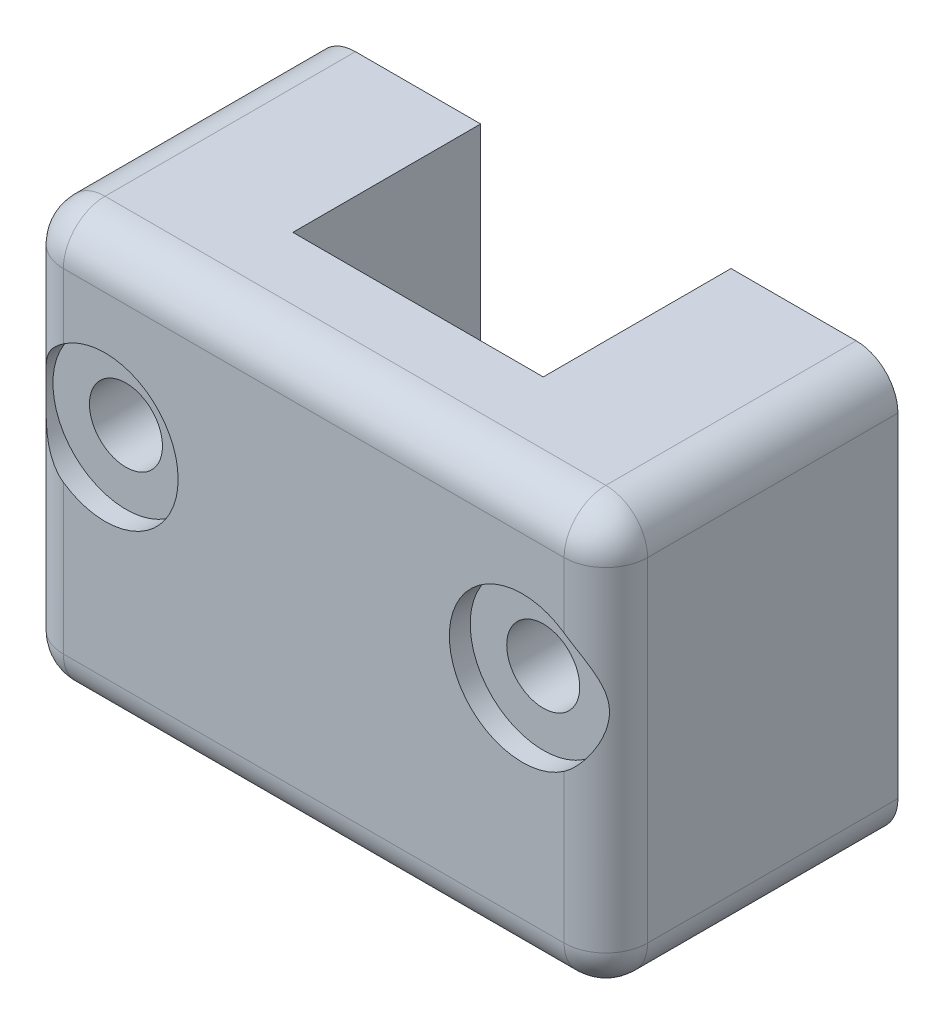
ISO-10303-21;
HEADER;
FILE_DESCRIPTION(('STEP AP214'),'2;1');
FILE_NAME('part.step','',(''),(''),'','','');
FILE_SCHEMA(('AUTOMOTIVE_DESIGN { 1 0 10303 214 1 1 1 1 }'));
ENDSEC;
DATA;
#1=APPLICATION_CONTEXT('core data for automotive mechanical design processes');
#2=APPLICATION_PROTOCOL_DEFINITION('international standard','automotive_design',2000,#1);
#3=PRODUCT_CONTEXT('',#1,'mechanical');
#4=PRODUCT('Part','Part','',(#3));
#5=PRODUCT_RELATED_PRODUCT_CATEGORY('part','',(#4));
#6=PRODUCT_DEFINITION_FORMATION('','',#4);
#7=PRODUCT_DEFINITION_CONTEXT('part definition',#1,'design');
#8=PRODUCT_DEFINITION('design','',#6,#7);
#9=PRODUCT_DEFINITION_SHAPE('','',#8);
#10=(LENGTH_UNIT() NAMED_UNIT(*) SI_UNIT(.MILLI.,.METRE.));
#11=(NAMED_UNIT(*) PLANE_ANGLE_UNIT() SI_UNIT($,.RADIAN.));
#12=(NAMED_UNIT(*) SI_UNIT($,.STERADIAN.) SOLID_ANGLE_UNIT());
#13=UNCERTAINTY_MEASURE_WITH_UNIT(LENGTH_MEASURE(1.E-05),#10,'distance_accuracy_value','');
#14=(GEOMETRIC_REPRESENTATION_CONTEXT(3) GLOBAL_UNCERTAINTY_ASSIGNED_CONTEXT((#13)) GLOBAL_UNIT_ASSIGNED_CONTEXT((#10,
#11,#12)) REPRESENTATION_CONTEXT('',''));
#15=CARTESIAN_POINT('',(0.,0.,0.));
#16=DIRECTION('',(0.,0.,1.));
#17=DIRECTION('',(1.,0.,0.));
#18=AXIS2_PLACEMENT_3D('',#15,#16,#17);
#19=CARTESIAN_POINT('',(10.,5.75,19.9497474683058));
#20=DIRECTION('',(0.,0.,-1.));
#21=DIRECTION('',(-1.,0.,0.));
#22=AXIS2_PLACEMENT_3D('',#19,#20,#21);
#23=CYLINDRICAL_SURFACE('',#22,1.75);
#24=CARTESIAN_POINT('',(10.,5.75,1.));
#25=DIRECTION('',(0.,0.,-1.));
#26=DIRECTION('',(-1.,0.,0.));
#27=AXIS2_PLACEMENT_3D('',#24,#25,#26);
#28=CIRCLE('',#27,1.75);
#29=CARTESIAN_POINT('',(8.25,5.75,1.));
#30=VERTEX_POINT('',#29);
#31=EDGE_CURVE('E172',#30,#30,#28,.T.);
#32=ORIENTED_EDGE('',*,*,#31,.T.);
#33=EDGE_LOOP('',(#32));
#34=FACE_BOUND('',#33,.T.);
#35=CARTESIAN_POINT('',(10.,5.75,14.));
#36=DIRECTION('',(0.,0.,1.));
#37=DIRECTION('',(1.,0.,0.));
#38=AXIS2_PLACEMENT_3D('',#35,#36,#37);
#39=CIRCLE('',#38,1.75);
#40=CARTESIAN_POINT('',(11.75,5.75,14.));
#41=VERTEX_POINT('',#40);
#42=EDGE_CURVE('E191',#41,#41,#39,.F.);
#43=ORIENTED_EDGE('',*,*,#42,.F.);
#44=EDGE_LOOP('',(#43));
#45=FACE_BOUND('',#44,.T.);
#46=ADVANCED_FACE('F37',(#34,#45),#23,.F.);
#47=CARTESIAN_POINT('',(-10.,5.75,19.9497474683058));
#48=DIRECTION('',(0.,0.,-1.));
#49=DIRECTION('',(-1.,0.,0.));
#50=AXIS2_PLACEMENT_3D('',#47,#48,#49);
#51=CYLINDRICAL_SURFACE('',#50,1.75);
#52=CARTESIAN_POINT('',(-10.,5.75,1.));
#53=DIRECTION('',(0.,0.,-1.));
#54=DIRECTION('',(-1.,0.,0.));
#55=AXIS2_PLACEMENT_3D('',#52,#53,#54);
#56=CIRCLE('',#55,1.75);
#57=CARTESIAN_POINT('',(-11.75,5.75,1.));
#58=VERTEX_POINT('',#57);
#59=EDGE_CURVE('E195',#58,#58,#56,.T.);
#60=ORIENTED_EDGE('',*,*,#59,.T.);
#61=EDGE_LOOP('',(#60));
#62=FACE_BOUND('',#61,.T.);
#63=CARTESIAN_POINT('',(-10.,5.75,14.));
#64=DIRECTION('',(0.,0.,1.));
#65=DIRECTION('',(1.,0.,0.));
#66=AXIS2_PLACEMENT_3D('',#63,#64,#65);
#67=CIRCLE('',#66,1.75);
#68=CARTESIAN_POINT('',(-8.25,5.75,14.));
#69=VERTEX_POINT('',#68);
#70=EDGE_CURVE('E188',#69,#69,#67,.F.);
#71=ORIENTED_EDGE('',*,*,#70,.F.);
#72=EDGE_LOOP('',(#71));
#73=FACE_BOUND('',#72,.T.);
#74=ADVANCED_FACE('F270',(#62,#73),#51,.F.);
#75=CARTESIAN_POINT('',(0.,-6.25,0.));
#76=DIRECTION('',(0.,-1.,0.));
#77=DIRECTION('',(0.,0.,-1.));
#78=AXIS2_PLACEMENT_3D('',#75,#76,#77);
#79=PLANE('',#78);
#80=DIRECTION('',(-1.,0.,0.));
#81=VECTOR('',#80,1.);
#82=CARTESIAN_POINT('',(6.,-6.25,1.));
#83=LINE('',#82,#81);
#84=CARTESIAN_POINT('',(12.,-6.25,1.));
#85=VERTEX_POINT('',#84);
#86=CARTESIAN_POINT('',(6.,-6.25,1.));
#87=VERTEX_POINT('',#86);
#88=EDGE_CURVE('E349',#85,#87,#83,.T.);
#89=ORIENTED_EDGE('',*,*,#88,.F.);
#90=DIRECTION('',(0.,0.,1.));
#91=VECTOR('',#90,1.);
#92=CARTESIAN_POINT('',(12.,-6.25,0.));
#93=LINE('',#92,#91);
#94=CARTESIAN_POINT('',(12.,-6.25,13.));
#95=VERTEX_POINT('',#94);
#96=EDGE_CURVE('E219',#85,#95,#93,.T.);
#97=ORIENTED_EDGE('',*,*,#96,.T.);
#98=DIRECTION('',(1.,0.,0.));
#99=VECTOR('',#98,1.);
#100=CARTESIAN_POINT('',(0.,-6.25,13.));
#101=LINE('',#100,#99);
#102=CARTESIAN_POINT('',(-12.,-6.25,13.));
#103=VERTEX_POINT('',#102);
#104=EDGE_CURVE('E217',#95,#103,#101,.F.);
#105=ORIENTED_EDGE('',*,*,#104,.T.);
#106=DIRECTION('',(0.,0.,1.));
#107=VECTOR('',#106,1.);
#108=CARTESIAN_POINT('',(-12.,-6.25,0.));
#109=LINE('',#108,#107);
#110=CARTESIAN_POINT('',(-12.,-6.25,1.));
#111=VERTEX_POINT('',#110);
#112=EDGE_CURVE('E215',#103,#111,#109,.F.);
#113=ORIENTED_EDGE('',*,*,#112,.T.);
#114=DIRECTION('',(-1.,0.,0.));
#115=VECTOR('',#114,1.);
#116=CARTESIAN_POINT('',(-6.,-6.25,1.));
#117=LINE('',#116,#115);
#118=CARTESIAN_POINT('',(-6.,-6.25,1.));
#119=VERTEX_POINT('',#118);
#120=EDGE_CURVE('E184',#119,#111,#117,.T.);
#121=ORIENTED_EDGE('',*,*,#120,.F.);
#122=DIRECTION('',(0.,0.,1.));
#123=VECTOR('',#122,1.);
#124=CARTESIAN_POINT('',(-6.,-6.25,0.));
#125=LINE('',#124,#123);
#126=CARTESIAN_POINT('',(-6.,-6.25,10.));
#127=VERTEX_POINT('',#126);
#128=EDGE_CURVE('E159',#119,#127,#125,.T.);
#129=ORIENTED_EDGE('',*,*,#128,.T.);
#130=DIRECTION('',(-1.,0.,0.));
#131=VECTOR('',#130,1.);
#132=CARTESIAN_POINT('',(6.,-6.25,10.));
#133=LINE('',#132,#131);
#134=CARTESIAN_POINT('',(6.,-6.25,10.));
#135=VERTEX_POINT('',#134);
#136=EDGE_CURVE('E151',#135,#127,#133,.T.);
#137=ORIENTED_EDGE('',*,*,#136,.F.);
#138=DIRECTION('',(0.,0.,-1.));
#139=VECTOR('',#138,1.);
#140=CARTESIAN_POINT('',(6.,-6.25,10.));
#141=LINE('',#140,#139);
#142=EDGE_CURVE('E156',#135,#87,#141,.T.);
#143=ORIENTED_EDGE('',*,*,#142,.T.);
#144=EDGE_LOOP('',(#89,#97,#105,#113,#121,#129,#137,#143));
#145=FACE_BOUND('',#144,.T.);
#146=ADVANCED_FACE('F154',(#145),#79,.T.);
#147=CARTESIAN_POINT('',(0.,13.75,0.));
#148=DIRECTION('',(0.,-1.,0.));
#149=DIRECTION('',(0.,0.,-1.));
#150=AXIS2_PLACEMENT_3D('',#147,#148,#149);
#151=PLANE('',#150);
#152=DIRECTION('',(-1.,0.,0.));
#153=VECTOR('',#152,1.);
#154=CARTESIAN_POINT('',(14.,13.75,13.));
#155=LINE('',#154,#153);
#156=CARTESIAN_POINT('',(-12.,13.75,13.));
#157=VERTEX_POINT('',#156);
#158=CARTESIAN_POINT('',(12.,13.75,13.));
#159=VERTEX_POINT('',#158);
#160=EDGE_CURVE('E210',#157,#159,#155,.F.);
#161=ORIENTED_EDGE('',*,*,#160,.T.);
#162=DIRECTION('',(0.,0.,1.));
#163=VECTOR('',#162,1.);
#164=CARTESIAN_POINT('',(12.,13.75,0.999999999999997));
#165=LINE('',#164,#163);
#166=CARTESIAN_POINT('',(12.,13.75,1.));
#167=VERTEX_POINT('',#166);
#168=EDGE_CURVE('E213',#159,#167,#165,.F.);
#169=ORIENTED_EDGE('',*,*,#168,.T.);
#170=DIRECTION('',(1.,0.,0.));
#171=VECTOR('',#170,1.);
#172=CARTESIAN_POINT('',(-14.,13.75,1.));
#173=LINE('',#172,#171);
#174=CARTESIAN_POINT('',(6.,13.75,1.));
#175=VERTEX_POINT('',#174);
#176=EDGE_CURVE('E340',#175,#167,#173,.T.);
#177=ORIENTED_EDGE('',*,*,#176,.F.);
#178=DIRECTION('',(0.,0.,-1.));
#179=VECTOR('',#178,1.);
#180=CARTESIAN_POINT('',(6.,13.75,10.));
#181=LINE('',#180,#179);
#182=CARTESIAN_POINT('',(6.,13.75,10.));
#183=VERTEX_POINT('',#182);
#184=EDGE_CURVE('E181',#183,#175,#181,.T.);
#185=ORIENTED_EDGE('',*,*,#184,.F.);
#186=DIRECTION('',(1.,0.,0.));
#187=VECTOR('',#186,1.);
#188=CARTESIAN_POINT('',(6.,13.75,10.));
#189=LINE('',#188,#187);
#190=CARTESIAN_POINT('',(-6.,13.75,10.));
#191=VERTEX_POINT('',#190);
#192=EDGE_CURVE('E168',#191,#183,#189,.T.);
#193=ORIENTED_EDGE('',*,*,#192,.F.);
#194=DIRECTION('',(0.,0.,1.));
#195=VECTOR('',#194,1.);
#196=CARTESIAN_POINT('',(-6.,13.75,0.));
#197=LINE('',#196,#195);
#198=CARTESIAN_POINT('',(-6.,13.75,1.));
#199=VERTEX_POINT('',#198);
#200=EDGE_CURVE('E176',#199,#191,#197,.T.);
#201=ORIENTED_EDGE('',*,*,#200,.F.);
#202=CARTESIAN_POINT('',(-12.,13.75,1.));
#203=VERTEX_POINT('',#202);
#204=EDGE_CURVE('E335',#203,#199,#173,.T.);
#205=ORIENTED_EDGE('',*,*,#204,.F.);
#206=DIRECTION('',(0.,0.,1.));
#207=VECTOR('',#206,1.);
#208=CARTESIAN_POINT('',(-12.,13.75,15.));
#209=LINE('',#208,#207);
#210=EDGE_CURVE('E208',#203,#157,#209,.T.);
#211=ORIENTED_EDGE('',*,*,#210,.T.);
#212=EDGE_LOOP('',(#161,#169,#177,#185,#193,#201,#205,#211));
#213=FACE_BOUND('',#212,.T.);
#214=ADVANCED_FACE('F302',(#213),#151,.F.);
#215=CARTESIAN_POINT('',(6.,-6.25,10.));
#216=DIRECTION('',(1.,0.,0.));
#217=DIRECTION('',(0.,0.,-1.));
#218=AXIS2_PLACEMENT_3D('',#215,#216,#217);
#219=PLANE('',#218);
#220=ORIENTED_EDGE('',*,*,#184,.T.);
#221=DIRECTION('',(0.,1.,0.));
#222=VECTOR('',#221,1.);
#223=CARTESIAN_POINT('',(6.,6.25,1.));
#224=LINE('',#223,#222);
#225=EDGE_CURVE('E175',#87,#175,#224,.T.);
#226=ORIENTED_EDGE('',*,*,#225,.F.);
#227=ORIENTED_EDGE('',*,*,#142,.F.);
#228=DIRECTION('',(0.,-1.,0.));
#229=VECTOR('',#228,1.);
#230=CARTESIAN_POINT('',(6.,13.75,10.));
#231=LINE('',#230,#229);
#232=EDGE_CURVE('E163',#183,#135,#231,.T.);
#233=ORIENTED_EDGE('',*,*,#232,.F.);
#234=EDGE_LOOP('',(#220,#226,#227,#233));
#235=FACE_BOUND('',#234,.T.);
#236=ADVANCED_FACE('F174',(#235),#219,.F.);
#237=CARTESIAN_POINT('',(-6.,-6.25,0.));
#238=DIRECTION('',(-1.,0.,0.));
#239=DIRECTION('',(0.,0.,1.));
#240=AXIS2_PLACEMENT_3D('',#237,#238,#239);
#241=PLANE('',#240);
#242=DIRECTION('',(0.,-1.,0.));
#243=VECTOR('',#242,1.);
#244=CARTESIAN_POINT('',(-6.,6.25,1.));
#245=LINE('',#244,#243);
#246=EDGE_CURVE('E351',#199,#119,#245,.T.);
#247=ORIENTED_EDGE('',*,*,#246,.F.);
#248=ORIENTED_EDGE('',*,*,#200,.T.);
#249=DIRECTION('',(0.,1.,0.));
#250=VECTOR('',#249,1.);
#251=CARTESIAN_POINT('',(-6.,13.75,10.));
#252=LINE('',#251,#250);
#253=EDGE_CURVE('E162',#127,#191,#252,.T.);
#254=ORIENTED_EDGE('',*,*,#253,.F.);
#255=ORIENTED_EDGE('',*,*,#128,.F.);
#256=EDGE_LOOP('',(#247,#248,#254,#255));
#257=FACE_BOUND('',#256,.T.);
#258=ADVANCED_FACE('F295',(#257),#241,.F.);
#259=CARTESIAN_POINT('',(0.,0.,15.));
#260=DIRECTION('',(0.,0.,1.));
#261=DIRECTION('',(1.,0.,0.));
#262=AXIS2_PLACEMENT_3D('',#259,#260,#261);
#263=PLANE('',#262);
#264=CARTESIAN_POINT('',(-10.,5.75,15.));
#265=DIRECTION('',(0.,0.,1.));
#266=DIRECTION('',(1.,0.,0.));
#267=AXIS2_PLACEMENT_3D('',#264,#265,#266);
#268=CIRCLE('',#267,3.5);
#269=CARTESIAN_POINT('',(-12.,2.87771867673099,15.));
#270=VERTEX_POINT('',#269);
#271=CARTESIAN_POINT('',(-12.,8.62228132326902,15.));
#272=VERTEX_POINT('',#271);
#273=EDGE_CURVE('E402',#270,#272,#268,.T.);
#274=ORIENTED_EDGE('',*,*,#273,.F.);
#275=DIRECTION('',(0.,-1.,0.));
#276=VECTOR('',#275,1.);
#277=CARTESIAN_POINT('',(-12.,0.,15.));
#278=LINE('',#277,#276);
#279=CARTESIAN_POINT('',(-12.,-4.25,15.));
#280=VERTEX_POINT('',#279);
#281=EDGE_CURVE('E206',#270,#280,#278,.T.);
#282=ORIENTED_EDGE('',*,*,#281,.T.);
#283=DIRECTION('',(1.,0.,0.));
#284=VECTOR('',#283,1.);
#285=CARTESIAN_POINT('',(0.,-4.25,15.));
#286=LINE('',#285,#284);
#287=CARTESIAN_POINT('',(12.,-4.25,15.));
#288=VERTEX_POINT('',#287);
#289=EDGE_CURVE('E204',#280,#288,#286,.T.);
#290=ORIENTED_EDGE('',*,*,#289,.T.);
#291=DIRECTION('',(0.,1.,0.));
#292=VECTOR('',#291,1.);
#293=CARTESIAN_POINT('',(12.,0.,15.));
#294=LINE('',#293,#292);
#295=CARTESIAN_POINT('',(12.,2.87771867673099,15.));
#296=VERTEX_POINT('',#295);
#297=EDGE_CURVE('E202',#288,#296,#294,.T.);
#298=ORIENTED_EDGE('',*,*,#297,.T.);
#299=CARTESIAN_POINT('',(10.,5.75,15.));
#300=DIRECTION('',(0.,0.,1.));
#301=DIRECTION('',(1.,0.,0.));
#302=AXIS2_PLACEMENT_3D('',#299,#300,#301);
#303=CIRCLE('',#302,3.5);
#304=CARTESIAN_POINT('',(12.,8.62228132326901,15.));
#305=VERTEX_POINT('',#304);
#306=EDGE_CURVE('E406',#305,#296,#303,.T.);
#307=ORIENTED_EDGE('',*,*,#306,.F.);
#308=DIRECTION('',(0.,1.,0.));
#309=VECTOR('',#308,1.);
#310=CARTESIAN_POINT('',(12.,0.,15.));
#311=LINE('',#310,#309);
#312=CARTESIAN_POINT('',(12.,11.75,15.));
#313=VERTEX_POINT('',#312);
#314=EDGE_CURVE('E178',#305,#313,#311,.T.);
#315=ORIENTED_EDGE('',*,*,#314,.T.);
#316=DIRECTION('',(-1.,0.,0.));
#317=VECTOR('',#316,1.);
#318=CARTESIAN_POINT('',(-14.,11.75,15.));
#319=LINE('',#318,#317);
#320=CARTESIAN_POINT('',(-12.,11.75,15.));
#321=VERTEX_POINT('',#320);
#322=EDGE_CURVE('E197',#313,#321,#319,.T.);
#323=ORIENTED_EDGE('',*,*,#322,.T.);
#324=DIRECTION('',(0.,-1.,0.));
#325=VECTOR('',#324,1.);
#326=CARTESIAN_POINT('',(-12.,0.,15.));
#327=LINE('',#326,#325);
#328=EDGE_CURVE('E200',#321,#272,#327,.T.);
#329=ORIENTED_EDGE('',*,*,#328,.T.);
#330=EDGE_LOOP('',(#274,#282,#290,#298,#307,#315,#323,#329));
#331=FACE_BOUND('',#330,.T.);
#332=ADVANCED_FACE('F291',(#331),#263,.T.);
#333=CARTESIAN_POINT('',(0.,0.,1.));
#334=DIRECTION('',(0.,0.,-1.));
#335=DIRECTION('',(-1.,0.,0.));
#336=AXIS2_PLACEMENT_3D('',#333,#334,#335);
#337=PLANE('',#336);
#338=ORIENTED_EDGE('',*,*,#59,.F.);
#339=EDGE_LOOP('',(#338));
#340=FACE_BOUND('',#339,.T.);
#341=DIRECTION('',(0.,-1.,0.));
#342=VECTOR('',#341,1.);
#343=CARTESIAN_POINT('',(-14.,13.75,1.));
#344=LINE('',#343,#342);
#345=CARTESIAN_POINT('',(-14.,11.75,1.));
#346=VERTEX_POINT('',#345);
#347=CARTESIAN_POINT('',(-14.,-4.25,1.));
#348=VERTEX_POINT('',#347);
#349=EDGE_CURVE('E337',#346,#348,#344,.T.);
#350=ORIENTED_EDGE('',*,*,#349,.F.);
#351=CARTESIAN_POINT('',(-12.,11.75,1.));
#352=DIRECTION('',(0.,0.,-1.));
#353=DIRECTION('',(-1.,0.,0.));
#354=AXIS2_PLACEMENT_3D('',#351,#352,#353);
#355=CIRCLE('',#354,2.);
#356=EDGE_CURVE('E237',#346,#203,#355,.T.);
#357=ORIENTED_EDGE('',*,*,#356,.T.);
#358=ORIENTED_EDGE('',*,*,#204,.T.);
#359=ORIENTED_EDGE('',*,*,#246,.T.);
#360=ORIENTED_EDGE('',*,*,#120,.T.);
#361=CARTESIAN_POINT('',(-12.,-4.25,1.));
#362=DIRECTION('',(0.,0.,-1.));
#363=DIRECTION('',(-1.,0.,0.));
#364=AXIS2_PLACEMENT_3D('',#361,#362,#363);
#365=CIRCLE('',#364,2.);
#366=EDGE_CURVE('E235',#111,#348,#365,.T.);
#367=ORIENTED_EDGE('',*,*,#366,.T.);
#368=EDGE_LOOP('',(#350,#357,#358,#359,#360,#367));
#369=FACE_BOUND('',#368,.T.);
#370=ADVANCED_FACE('F287',(#340,#369),#337,.T.);
#371=CARTESIAN_POINT('',(0.,0.,1.));
#372=DIRECTION('',(0.,0.,1.));
#373=DIRECTION('',(1.,0.,0.));
#374=AXIS2_PLACEMENT_3D('',#371,#372,#373);
#375=PLANE('',#374);
#376=ORIENTED_EDGE('',*,*,#31,.F.);
#377=EDGE_LOOP('',(#376));
#378=FACE_BOUND('',#377,.T.);
#379=DIRECTION('',(0.,1.,0.));
#380=VECTOR('',#379,1.);
#381=CARTESIAN_POINT('',(14.,13.75,1.));
#382=LINE('',#381,#380);
#383=CARTESIAN_POINT('',(14.,-4.25,1.));
#384=VERTEX_POINT('',#383);
#385=CARTESIAN_POINT('',(14.,11.75,1.));
#386=VERTEX_POINT('',#385);
#387=EDGE_CURVE('E339',#384,#386,#382,.T.);
#388=ORIENTED_EDGE('',*,*,#387,.F.);
#389=CARTESIAN_POINT('',(12.,-4.25,1.));
#390=DIRECTION('',(0.,0.,1.));
#391=DIRECTION('',(1.,0.,0.));
#392=AXIS2_PLACEMENT_3D('',#389,#390,#391);
#393=CIRCLE('',#392,2.);
#394=EDGE_CURVE('E229',#384,#85,#393,.F.);
#395=ORIENTED_EDGE('',*,*,#394,.T.);
#396=ORIENTED_EDGE('',*,*,#88,.T.);
#397=ORIENTED_EDGE('',*,*,#225,.T.);
#398=ORIENTED_EDGE('',*,*,#176,.T.);
#399=CARTESIAN_POINT('',(12.,11.75,1.));
#400=DIRECTION('',(0.,0.,1.));
#401=DIRECTION('',(1.,0.,0.));
#402=AXIS2_PLACEMENT_3D('',#399,#400,#401);
#403=CIRCLE('',#402,2.);
#404=EDGE_CURVE('E227',#167,#386,#403,.F.);
#405=ORIENTED_EDGE('',*,*,#404,.T.);
#406=EDGE_LOOP('',(#388,#395,#396,#397,#398,#405));
#407=FACE_BOUND('',#406,.T.);
#408=ADVANCED_FACE('F284',(#378,#407),#375,.F.);
#409=CARTESIAN_POINT('',(-14.,13.75,-19.3960780543711));
#410=DIRECTION('',(-1.,0.,0.));
#411=DIRECTION('',(0.,-1.,0.));
#412=AXIS2_PLACEMENT_3D('',#409,#410,#411);
#413=PLANE('',#412);
#414=DIRECTION('',(0.,-1.,0.));
#415=VECTOR('',#414,1.);
#416=CARTESIAN_POINT('',(-14.,13.75,13.));
#417=LINE('',#416,#415);
#418=CARTESIAN_POINT('',(-14.,-4.25,13.));
#419=VERTEX_POINT('',#418);
#420=CARTESIAN_POINT('',(-14.,11.75,13.));
#421=VERTEX_POINT('',#420);
#422=EDGE_CURVE('E54',#419,#421,#417,.F.);
#423=ORIENTED_EDGE('',*,*,#422,.T.);
#424=DIRECTION('',(0.,0.,1.));
#425=VECTOR('',#424,1.);
#426=CARTESIAN_POINT('',(-14.,11.75,1.));
#427=LINE('',#426,#425);
#428=EDGE_CURVE('E233',#421,#346,#427,.F.);
#429=ORIENTED_EDGE('',*,*,#428,.T.);
#430=ORIENTED_EDGE('',*,*,#349,.T.);
#431=DIRECTION('',(0.,0.,1.));
#432=VECTOR('',#431,1.);
#433=CARTESIAN_POINT('',(-14.,-4.25,-19.3960780543711));
#434=LINE('',#433,#432);
#435=EDGE_CURVE('E59',#348,#419,#434,.T.);
#436=ORIENTED_EDGE('',*,*,#435,.T.);
#437=EDGE_LOOP('',(#423,#429,#430,#436));
#438=FACE_BOUND('',#437,.T.);
#439=ADVANCED_FACE('F280',(#438),#413,.T.);
#440=CARTESIAN_POINT('',(14.,13.75,-19.3960780543711));
#441=DIRECTION('',(1.,0.,0.));
#442=DIRECTION('',(0.,1.,0.));
#443=AXIS2_PLACEMENT_3D('',#440,#441,#442);
#444=PLANE('',#443);
#445=DIRECTION('',(0.,1.,0.));
#446=VECTOR('',#445,1.);
#447=CARTESIAN_POINT('',(14.,13.75,13.));
#448=LINE('',#447,#446);
#449=CARTESIAN_POINT('',(14.,11.75,13.));
#450=VERTEX_POINT('',#449);
#451=CARTESIAN_POINT('',(14.,-4.25,13.));
#452=VERTEX_POINT('',#451);
#453=EDGE_CURVE('E221',#450,#452,#448,.F.);
#454=ORIENTED_EDGE('',*,*,#453,.T.);
#455=DIRECTION('',(0.,0.,1.));
#456=VECTOR('',#455,1.);
#457=CARTESIAN_POINT('',(14.,-4.25,-19.3960780543711));
#458=LINE('',#457,#456);
#459=EDGE_CURVE('E225',#452,#384,#458,.F.);
#460=ORIENTED_EDGE('',*,*,#459,.T.);
#461=ORIENTED_EDGE('',*,*,#387,.T.);
#462=DIRECTION('',(0.,0.,1.));
#463=VECTOR('',#462,1.);
#464=CARTESIAN_POINT('',(14.,11.75,15.));
#465=LINE('',#464,#463);
#466=EDGE_CURVE('E223',#386,#450,#465,.T.);
#467=ORIENTED_EDGE('',*,*,#466,.T.);
#468=EDGE_LOOP('',(#454,#460,#461,#467));
#469=FACE_BOUND('',#468,.T.);
#470=ADVANCED_FACE('F277',(#469),#444,.T.);
#471=CARTESIAN_POINT('',(0.,0.,10.));
#472=DIRECTION('',(0.,0.,-1.));
#473=DIRECTION('',(-1.,0.,0.));
#474=AXIS2_PLACEMENT_3D('',#471,#472,#473);
#475=PLANE('',#474);
#476=ORIENTED_EDGE('',*,*,#232,.T.);
#477=ORIENTED_EDGE('',*,*,#136,.T.);
#478=ORIENTED_EDGE('',*,*,#253,.T.);
#479=ORIENTED_EDGE('',*,*,#192,.T.);
#480=EDGE_LOOP('',(#476,#477,#478,#479));
#481=FACE_BOUND('',#480,.T.);
#482=ADVANCED_FACE('F166',(#481),#475,.T.);
#483=CARTESIAN_POINT('',(-10.,5.75,14.));
#484=DIRECTION('',(0.,0.,1.));
#485=DIRECTION('',(1.,0.,0.));
#486=AXIS2_PLACEMENT_3D('',#483,#484,#485);
#487=PLANE('',#486);
#488=CARTESIAN_POINT('',(-10.,5.75,14.));
#489=DIRECTION('',(0.,0.,1.));
#490=DIRECTION('',(1.,0.,0.));
#491=AXIS2_PLACEMENT_3D('',#488,#489,#490);
#492=CIRCLE('',#491,3.5);
#493=CARTESIAN_POINT('',(-6.5,5.75,14.));
#494=VERTEX_POINT('',#493);
#495=EDGE_CURVE('E399',#494,#494,#492,.T.);
#496=ORIENTED_EDGE('',*,*,#495,.T.);
#497=EDGE_LOOP('',(#496));
#498=FACE_BOUND('',#497,.T.);
#499=ORIENTED_EDGE('',*,*,#70,.T.);
#500=EDGE_LOOP('',(#499));
#501=FACE_BOUND('',#500,.T.);
#502=ADVANCED_FACE('F260',(#498,#501),#487,.T.);
#503=CARTESIAN_POINT('',(-10.,5.75,14.));
#504=DIRECTION('',(0.,0.,1.));
#505=DIRECTION('',(1.,0.,0.));
#506=AXIS2_PLACEMENT_3D('',#503,#504,#505);
#507=CYLINDRICAL_SURFACE('',#506,3.5);
#508=ORIENTED_EDGE('',*,*,#495,.F.);
#509=EDGE_LOOP('',(#508));
#510=FACE_BOUND('',#509,.T.);
#511=ORIENTED_EDGE('',*,*,#273,.T.);
#512=CARTESIAN_POINT('',(-12.,8.62228132326902,15.));
#513=CARTESIAN_POINT('',(-12.0707404529385,8.57305148371689,14.9999975985316));
#514=CARTESIAN_POINT('',(-12.1395514673426,8.52123281180509,14.9962499540065));
#515=CARTESIAN_POINT('',(-12.2726511080301,8.41314559761035,14.9824544929225));
#516=CARTESIAN_POINT('',(-12.3369505060331,8.35688838653779,14.9724222927287));
#517=CARTESIAN_POINT('',(-12.4600811145566,8.24100216189633,14.9473660892893));
#518=CARTESIAN_POINT('',(-12.5189618231834,8.18141384326659,14.9323945625418));
#519=CARTESIAN_POINT('',(-12.6318292156607,8.0587709289923,14.8984904512209));
#520=CARTESIAN_POINT('',(-12.6858123972928,7.99571390383838,14.8795550636013));
#521=CARTESIAN_POINT('',(-12.7996630823864,7.8528337029009,14.8344051308554));
#522=CARTESIAN_POINT('',(-12.8583515028797,7.77229033694317,14.8074984513498));
#523=CARTESIAN_POINT('',(-12.9682954079903,7.60716655519253,14.7510632053208));
#524=CARTESIAN_POINT('',(-13.0195497400888,7.5225855161283,14.7215342334008));
#525=CARTESIAN_POINT('',(-13.1148353209157,7.3492567236845,14.6614231192136));
#526=CARTESIAN_POINT('',(-13.1588329133992,7.26049188215087,14.6308368239197));
#527=CARTESIAN_POINT('',(-13.2392382520641,7.07934708452369,14.5706088948472));
#528=CARTESIAN_POINT('',(-13.27564818348,6.98696817840352,14.5409669911743));
#529=CARTESIAN_POINT('',(-13.3563922850762,6.75319162133889,14.471139463264));
#530=CARTESIAN_POINT('',(-13.3961286387685,6.60956757583049,14.4327307009885));
#531=CARTESIAN_POINT('',(-13.4419206260524,6.38935364679522,14.3861246993893));
#532=CARTESIAN_POINT('',(-13.4548697982814,6.3153121921326,14.3724410590487));
#533=CARTESIAN_POINT('',(-13.4760230038234,6.16587330215798,14.3496661016538));
#534=CARTESIAN_POINT('',(-13.4842299683005,6.09047673422643,14.3405719482733));
#535=CARTESIAN_POINT('',(-13.4957966824141,5.93794424289336,14.3276561588066));
#536=CARTESIAN_POINT('',(-13.4990976794361,5.86079829709572,14.3238984539748));
#537=CARTESIAN_POINT('',(-13.5005798078859,5.706395999454,14.3222185071639));
#538=CARTESIAN_POINT('',(-13.4987611854201,5.62913965309544,14.3242959846807));
#539=CARTESIAN_POINT('',(-13.4900426658933,5.47510694088815,14.334096674335));
#540=CARTESIAN_POINT('',(-13.4831313757682,5.39833204111702,14.3418325448641));
#541=CARTESIAN_POINT('',(-13.4643793886994,5.24604292991952,14.3622717970667));
#542=CARTESIAN_POINT('',(-13.452535396036,5.17052959654322,14.3749784995904));
#543=CARTESIAN_POINT('',(-13.4037715097876,4.91423823269435,14.4254408439194));
#544=CARTESIAN_POINT('',(-13.3552231363788,4.73747812666193,14.4730193445007));
#545=CARTESIAN_POINT('',(-13.2633037874413,4.48147761718882,14.5510321751375));
#546=CARTESIAN_POINT('',(-13.2293788256557,4.39748082894041,14.5782157323008));
#547=CARTESIAN_POINT('',(-13.1552327974387,4.2325480139004,14.6332679461288));
#548=CARTESIAN_POINT('',(-13.1150152148331,4.15161032408162,14.661136216557));
#549=CARTESIAN_POINT('',(-13.0263144925784,3.98921005791501,14.7174304976417));
#550=CARTESIAN_POINT('',(-12.977533718083,3.90789846435229,14.745822073934));
#551=CARTESIAN_POINT('',(-12.8731152969813,3.74893798191831,14.8003164209095));
#552=CARTESIAN_POINT('',(-12.8174758256442,3.67129007538795,14.8264185793265));
#553=CARTESIAN_POINT('',(-12.6997207770924,3.52051517763947,14.874677825244));
#554=CARTESIAN_POINT('',(-12.6376447616087,3.44736451184677,14.8968569818361));
#555=CARTESIAN_POINT('',(-12.5069362532296,3.30571162138766,14.9358880276237));
#556=CARTESIAN_POINT('',(-12.438309792973,3.23720521717019,14.9527447580287));
#557=CARTESIAN_POINT('',(-12.3092971573975,3.11880622701179,14.9767973594979));
#558=CARTESIAN_POINT('',(-12.2500388181988,3.06794533503691,14.9852557477087));
#559=CARTESIAN_POINT('',(-12.1277302320402,2.96989955665786,14.9968656209606));
#560=CARTESIAN_POINT('',(-12.0646673674991,2.92272824512083,14.9999983140612));
#561=CARTESIAN_POINT('',(-12.,2.87771867673099,15.));
#562=B_SPLINE_CURVE_WITH_KNOTS('',3,(#512,#513,#514,#515,#516,#517,#518,#519,#520,#521,#522,
#523,#524,#525,#526,#527,#528,#529,#530,#531,#532,#533,#534,#535,#536,#537,#538,#539,#540,#541,
#542,#543,#544,#545,#546,#547,#548,#549,#550,#551,#552,#553,#554,#555,#556,#557,#558,#559,#560,
#561),.UNSPECIFIED.,.F.,.F.,(4,2,2,2,2,2,2,2,2,2,2,2,2,2,2,2,2,2,2,2,2,2,2,2,4),(0.,
0.258262726506893,0.515886233039875,0.770856385430241,1.0260074528668,1.33525563414267,
1.64455170754477,1.95524422021814,2.26584712990298,2.7256841696026,2.95464878925982,
3.18347173380987,3.41501352230894,3.64654418050421,3.87859438627656,4.11079988267341,
4.67533008056769,4.95893133837147,5.24237613609196,5.53901658979896,5.83573613461833,
6.13072934848226,6.4254534621944,6.66076236963177,6.89689986428022),.UNSPECIFIED.);
#563=EDGE_CURVE('E46',#272,#270,#562,.T.);
#564=ORIENTED_EDGE('',*,*,#563,.T.);
#565=EDGE_LOOP('',(#511,#564));
#566=FACE_BOUND('',#565,.T.);
#567=ADVANCED_FACE('F255',(#510,#566),#507,.F.);
#568=CARTESIAN_POINT('',(10.,5.75,14.));
#569=DIRECTION('',(0.,0.,1.));
#570=DIRECTION('',(1.,0.,0.));
#571=AXIS2_PLACEMENT_3D('',#568,#569,#570);
#572=PLANE('',#571);
#573=CARTESIAN_POINT('',(10.,5.75,14.));
#574=DIRECTION('',(0.,0.,1.));
#575=DIRECTION('',(1.,0.,0.));
#576=AXIS2_PLACEMENT_3D('',#573,#574,#575);
#577=CIRCLE('',#576,3.5);
#578=CARTESIAN_POINT('',(13.5,5.75,14.));
#579=VERTEX_POINT('',#578);
#580=EDGE_CURVE('E192',#579,#579,#577,.T.);
#581=ORIENTED_EDGE('',*,*,#580,.T.);
#582=EDGE_LOOP('',(#581));
#583=FACE_BOUND('',#582,.T.);
#584=ORIENTED_EDGE('',*,*,#42,.T.);
#585=EDGE_LOOP('',(#584));
#586=FACE_BOUND('',#585,.T.);
#587=ADVANCED_FACE('F259',(#583,#586),#572,.T.);
#588=CARTESIAN_POINT('',(10.,5.75,14.));
#589=DIRECTION('',(0.,0.,1.));
#590=DIRECTION('',(1.,0.,0.));
#591=AXIS2_PLACEMENT_3D('',#588,#589,#590);
#592=CYLINDRICAL_SURFACE('',#591,3.5);
#593=ORIENTED_EDGE('',*,*,#580,.F.);
#594=EDGE_LOOP('',(#593));
#595=FACE_BOUND('',#594,.T.);
#596=ORIENTED_EDGE('',*,*,#306,.T.);
#597=CARTESIAN_POINT('',(12.,2.87771867673099,15.));
#598=CARTESIAN_POINT('',(12.0707404529385,2.92694851628312,14.9999975985316));
#599=CARTESIAN_POINT('',(12.1395514673426,2.97876718819491,14.9962499540065));
#600=CARTESIAN_POINT('',(12.2726511080301,3.08685440238965,14.9824544929225));
#601=CARTESIAN_POINT('',(12.3369505060331,3.14311161346221,14.9724222927287));
#602=CARTESIAN_POINT('',(12.4600811145566,3.25899783810368,14.9473660892893));
#603=CARTESIAN_POINT('',(12.5189618231834,3.31858615673342,14.9323945625418));
#604=CARTESIAN_POINT('',(12.6318292156607,3.4412290710077,14.8984904512209));
#605=CARTESIAN_POINT('',(12.6858123972928,3.50428609616163,14.8795550636013));
#606=CARTESIAN_POINT('',(12.7996630823864,3.64716629709911,14.8344051308554));
#607=CARTESIAN_POINT('',(12.8583515028797,3.72770966305683,14.8074984513498));
#608=CARTESIAN_POINT('',(12.9682954079903,3.89283344480747,14.7510632053208));
#609=CARTESIAN_POINT('',(13.0195497400888,3.9774144838717,14.7215342334008));
#610=CARTESIAN_POINT('',(13.1148353209157,4.15074327631551,14.6614231192136));
#611=CARTESIAN_POINT('',(13.1588329133992,4.23950811784914,14.6308368239197));
#612=CARTESIAN_POINT('',(13.2392382520642,4.42065291547631,14.5706088948472));
#613=CARTESIAN_POINT('',(13.27564818348,4.51303182159648,14.5409669911743));
#614=CARTESIAN_POINT('',(13.3563922850762,4.74680837866112,14.471139463264));
#615=CARTESIAN_POINT('',(13.3961286387685,4.89043242416952,14.4327307009885));
#616=CARTESIAN_POINT('',(13.4419206260524,5.11064635320479,14.3861246993893));
#617=CARTESIAN_POINT('',(13.4548697982814,5.18468780786741,14.3724410590487));
#618=CARTESIAN_POINT('',(13.4760230038234,5.33412669784203,14.3496661016538));
#619=CARTESIAN_POINT('',(13.4842299683005,5.40952326577357,14.3405719482733));
#620=CARTESIAN_POINT('',(13.4957966824141,5.56205575710665,14.3276561588066));
#621=CARTESIAN_POINT('',(13.4990976794361,5.63920170290429,14.3238984539748));
#622=CARTESIAN_POINT('',(13.5005798078859,5.79360400054601,14.3222185071639));
#623=CARTESIAN_POINT('',(13.4987611854201,5.87086034690457,14.3242959846807));
#624=CARTESIAN_POINT('',(13.4900426658933,6.02489305911186,14.334096674335));
#625=CARTESIAN_POINT('',(13.4831313757682,6.10166795888299,14.3418325448641));
#626=CARTESIAN_POINT('',(13.4643793886994,6.25395707008049,14.3622717970667));
#627=CARTESIAN_POINT('',(13.452535396036,6.32947040345679,14.3749784995904));
#628=CARTESIAN_POINT('',(13.4037715097876,6.58576176730566,14.4254408439194));
#629=CARTESIAN_POINT('',(13.3552231363788,6.76252187333808,14.4730193445007));
#630=CARTESIAN_POINT('',(13.2633037874413,7.01852238281119,14.5510321751375));
#631=CARTESIAN_POINT('',(13.2293788256557,7.1025191710596,14.5782157323008));
#632=CARTESIAN_POINT('',(13.1552327974387,7.26745198609961,14.6332679461288));
#633=CARTESIAN_POINT('',(13.1150152148331,7.34838967591839,14.661136216557));
#634=CARTESIAN_POINT('',(13.0263144925784,7.510789942085,14.7174304976417));
#635=CARTESIAN_POINT('',(12.977533718083,7.59210153564772,14.745822073934));
#636=CARTESIAN_POINT('',(12.8731152969813,7.7510620180817,14.8003164209095));
#637=CARTESIAN_POINT('',(12.8174758256442,7.82870992461206,14.8264185793265));
#638=CARTESIAN_POINT('',(12.6997207770924,7.97948482236055,14.874677825244));
#639=CARTESIAN_POINT('',(12.6376447616087,8.05263548815325,14.8968569818362));
#640=CARTESIAN_POINT('',(12.5069362532296,8.19428837861236,14.9358880276237));
#641=CARTESIAN_POINT('',(12.438309792973,8.26279478282982,14.9527447580287));
#642=CARTESIAN_POINT('',(12.3092971573975,8.38119377298822,14.9767973594979));
#643=CARTESIAN_POINT('',(12.2500388181988,8.4320546649631,14.9852557477087));
#644=CARTESIAN_POINT('',(12.1277302320402,8.53010044334214,14.9968656209606));
#645=CARTESIAN_POINT('',(12.0646673674991,8.57727175487917,14.9999983140612));
#646=CARTESIAN_POINT('',(12.,8.62228132326901,15.));
#647=B_SPLINE_CURVE_WITH_KNOTS('',3,(#597,#598,#599,#600,#601,#602,#603,#604,#605,#606,#607,
#608,#609,#610,#611,#612,#613,#614,#615,#616,#617,#618,#619,#620,#621,#622,#623,#624,#625,#626,
#627,#628,#629,#630,#631,#632,#633,#634,#635,#636,#637,#638,#639,#640,#641,#642,#643,#644,#645,
#646),.UNSPECIFIED.,.F.,.F.,(4,2,2,2,2,2,2,2,2,2,2,2,2,2,2,2,2,2,2,2,2,2,2,2,4),(0.,
0.258262726506893,0.515886233039874,0.77085638543024,1.0260074528668,1.33525563414267,
1.64455170754477,1.95524422021814,2.26584712990299,2.72568416960261,2.95464878925982,
3.18347173380987,3.41501352230895,3.64654418050421,3.87859438627656,4.11079988267342,
4.6753300805677,4.95893133837147,5.24237613609196,5.53901658979897,5.83573613461833,
6.13072934848227,6.42545346219441,6.66076236963177,6.8968998642802),.UNSPECIFIED.);
#648=EDGE_CURVE('E11',#296,#305,#647,.T.);
#649=ORIENTED_EDGE('',*,*,#648,.T.);
#650=EDGE_LOOP('',(#596,#649));
#651=FACE_BOUND('',#650,.T.);
#652=ADVANCED_FACE('F262',(#595,#651),#592,.F.);
#653=CARTESIAN_POINT('',(12.,-4.25,0.));
#654=DIRECTION('',(0.,0.,1.));
#655=DIRECTION('',(1.,0.,0.));
#656=AXIS2_PLACEMENT_3D('',#653,#654,#655);
#657=CYLINDRICAL_SURFACE('',#656,2.);
#658=ORIENTED_EDGE('',*,*,#394,.F.);
#659=ORIENTED_EDGE('',*,*,#459,.F.);
#660=CARTESIAN_POINT('',(12.,-4.25,13.));
#661=DIRECTION('',(0.,0.,1.));
#662=DIRECTION('',(1.,0.,0.));
#663=AXIS2_PLACEMENT_3D('',#660,#661,#662);
#664=CIRCLE('',#663,2.);
#665=EDGE_CURVE('E41',#95,#452,#664,.T.);
#666=ORIENTED_EDGE('',*,*,#665,.F.);
#667=ORIENTED_EDGE('',*,*,#96,.F.);
#668=EDGE_LOOP('',(#658,#659,#666,#667));
#669=FACE_BOUND('',#668,.T.);
#670=ADVANCED_FACE('F39',(#669),#657,.T.);
#671=CARTESIAN_POINT('',(0.,-4.25,13.));
#672=DIRECTION('',(1.,0.,0.));
#673=DIRECTION('',(0.,0.,-1.));
#674=AXIS2_PLACEMENT_3D('',#671,#672,#673);
#675=CYLINDRICAL_SURFACE('',#674,2.);
#676=CARTESIAN_POINT('',(-12.,-4.25,13.));
#677=DIRECTION('',(-1.,0.,0.));
#678=DIRECTION('',(0.,0.,1.));
#679=AXIS2_PLACEMENT_3D('',#676,#677,#678);
#680=CIRCLE('',#679,2.);
#681=EDGE_CURVE('E363',#103,#280,#680,.T.);
#682=ORIENTED_EDGE('',*,*,#681,.F.);
#683=ORIENTED_EDGE('',*,*,#104,.F.);
#684=CARTESIAN_POINT('',(12.,-4.25,13.));
#685=DIRECTION('',(1.,0.,0.));
#686=DIRECTION('',(0.,0.,-1.));
#687=AXIS2_PLACEMENT_3D('',#684,#685,#686);
#688=CIRCLE('',#687,2.);
#689=EDGE_CURVE('E393',#288,#95,#688,.T.);
#690=ORIENTED_EDGE('',*,*,#689,.F.);
#691=ORIENTED_EDGE('',*,*,#289,.F.);
#692=EDGE_LOOP('',(#682,#683,#690,#691));
#693=FACE_BOUND('',#692,.T.);
#694=ADVANCED_FACE('F438',(#693),#675,.T.);
#695=CARTESIAN_POINT('',(-12.,-4.25,-19.3960780543711));
#696=DIRECTION('',(0.,0.,1.));
#697=DIRECTION('',(1.,0.,0.));
#698=AXIS2_PLACEMENT_3D('',#695,#696,#697);
#699=CYLINDRICAL_SURFACE('',#698,2.);
#700=ORIENTED_EDGE('',*,*,#366,.F.);
#701=ORIENTED_EDGE('',*,*,#112,.F.);
#702=CARTESIAN_POINT('',(-12.,-4.25,13.));
#703=DIRECTION('',(0.,0.,1.));
#704=DIRECTION('',(1.,0.,0.));
#705=AXIS2_PLACEMENT_3D('',#702,#703,#704);
#706=CIRCLE('',#705,2.);
#707=EDGE_CURVE('E359',#419,#103,#706,.T.);
#708=ORIENTED_EDGE('',*,*,#707,.F.);
#709=ORIENTED_EDGE('',*,*,#435,.F.);
#710=EDGE_LOOP('',(#700,#701,#708,#709));
#711=FACE_BOUND('',#710,.T.);
#712=ADVANCED_FACE('F356',(#711),#699,.T.);
#713=CARTESIAN_POINT('',(12.,-4.25,13.));
#714=DIRECTION('',(0.,-1.,0.));
#715=DIRECTION('',(0.,0.,-1.));
#716=AXIS2_PLACEMENT_3D('',#713,#714,#715);
#717=SPHERICAL_SURFACE('',#716,2.);
#718=ORIENTED_EDGE('',*,*,#689,.T.);
#719=ORIENTED_EDGE('',*,*,#665,.T.);
#720=CARTESIAN_POINT('',(12.,-4.25,13.));
#721=DIRECTION('',(0.,-1.,0.));
#722=DIRECTION('',(0.,0.,-1.));
#723=AXIS2_PLACEMENT_3D('',#720,#721,#722);
#724=CIRCLE('',#723,2.);
#725=EDGE_CURVE('E364',#288,#452,#724,.F.);
#726=ORIENTED_EDGE('',*,*,#725,.F.);
#727=EDGE_LOOP('',(#718,#719,#726));
#728=FACE_BOUND('',#727,.T.);
#729=ADVANCED_FACE('F430',(#728),#717,.T.);
#730=CARTESIAN_POINT('',(-12.,-4.25,13.));
#731=DIRECTION('',(0.,-1.,0.));
#732=DIRECTION('',(0.,0.,-1.));
#733=AXIS2_PLACEMENT_3D('',#730,#731,#732);
#734=SPHERICAL_SURFACE('',#733,2.);
#735=ORIENTED_EDGE('',*,*,#707,.T.);
#736=ORIENTED_EDGE('',*,*,#681,.T.);
#737=CARTESIAN_POINT('',(-12.,-4.25,13.));
#738=DIRECTION('',(0.,-1.,0.));
#739=DIRECTION('',(1.,0.,0.));
#740=AXIS2_PLACEMENT_3D('',#737,#738,#739);
#741=CIRCLE('',#740,2.);
#742=EDGE_CURVE('E367',#419,#280,#741,.F.);
#743=ORIENTED_EDGE('',*,*,#742,.F.);
#744=EDGE_LOOP('',(#735,#736,#743));
#745=FACE_BOUND('',#744,.T.);
#746=ADVANCED_FACE('F368',(#745),#734,.T.);
#747=CARTESIAN_POINT('',(12.,11.75,-19.3960780543711));
#748=DIRECTION('',(0.,0.,-1.));
#749=DIRECTION('',(-1.,0.,0.));
#750=AXIS2_PLACEMENT_3D('',#747,#748,#749);
#751=CYLINDRICAL_SURFACE('',#750,2.);
#752=ORIENTED_EDGE('',*,*,#404,.F.);
#753=ORIENTED_EDGE('',*,*,#168,.F.);
#754=CARTESIAN_POINT('',(12.,11.75,13.));
#755=DIRECTION('',(0.,0.,1.));
#756=DIRECTION('',(1.,0.,0.));
#757=AXIS2_PLACEMENT_3D('',#754,#755,#756);
#758=CIRCLE('',#757,2.);
#759=EDGE_CURVE('E370',#450,#159,#758,.T.);
#760=ORIENTED_EDGE('',*,*,#759,.F.);
#761=ORIENTED_EDGE('',*,*,#466,.F.);
#762=EDGE_LOOP('',(#752,#753,#760,#761));
#763=FACE_BOUND('',#762,.T.);
#764=ADVANCED_FACE('F420',(#763),#751,.T.);
#765=CARTESIAN_POINT('',(12.,0.,13.));
#766=DIRECTION('',(0.,1.,0.));
#767=DIRECTION('',(-1.,0.,0.));
#768=AXIS2_PLACEMENT_3D('',#765,#766,#767);
#769=CYLINDRICAL_SURFACE('',#768,2.);
#770=ORIENTED_EDGE('',*,*,#725,.T.);
#771=ORIENTED_EDGE('',*,*,#453,.F.);
#772=CARTESIAN_POINT('',(12.,11.75,13.));
#773=DIRECTION('',(0.,1.,0.));
#774=DIRECTION('',(0.,0.,1.));
#775=AXIS2_PLACEMENT_3D('',#772,#773,#774);
#776=CIRCLE('',#775,2.);
#777=EDGE_CURVE('E378',#313,#450,#776,.T.);
#778=ORIENTED_EDGE('',*,*,#777,.F.);
#779=ORIENTED_EDGE('',*,*,#314,.F.);
#780=ORIENTED_EDGE('',*,*,#648,.F.);
#781=ORIENTED_EDGE('',*,*,#297,.F.);
#782=EDGE_LOOP('',(#770,#771,#778,#779,#780,#781));
#783=FACE_BOUND('',#782,.T.);
#784=ADVANCED_FACE('F325',(#783),#769,.T.);
#785=CARTESIAN_POINT('',(-12.,0.,13.));
#786=DIRECTION('',(0.,-1.,0.));
#787=DIRECTION('',(1.,0.,0.));
#788=AXIS2_PLACEMENT_3D('',#785,#786,#787);
#789=CYLINDRICAL_SURFACE('',#788,2.);
#790=ORIENTED_EDGE('',*,*,#563,.F.);
#791=ORIENTED_EDGE('',*,*,#328,.F.);
#792=CARTESIAN_POINT('',(-12.,11.75,13.));
#793=DIRECTION('',(0.,1.,0.));
#794=DIRECTION('',(0.,0.,1.));
#795=AXIS2_PLACEMENT_3D('',#792,#793,#794);
#796=CIRCLE('',#795,2.);
#797=EDGE_CURVE('E375',#421,#321,#796,.T.);
#798=ORIENTED_EDGE('',*,*,#797,.F.);
#799=ORIENTED_EDGE('',*,*,#422,.F.);
#800=ORIENTED_EDGE('',*,*,#742,.T.);
#801=ORIENTED_EDGE('',*,*,#281,.F.);
#802=EDGE_LOOP('',(#790,#791,#798,#799,#800,#801));
#803=FACE_BOUND('',#802,.T.);
#804=ADVANCED_FACE('F252',(#803),#789,.T.);
#805=CARTESIAN_POINT('',(-12.,11.75,0.));
#806=DIRECTION('',(0.,0.,-1.));
#807=DIRECTION('',(-1.,0.,0.));
#808=AXIS2_PLACEMENT_3D('',#805,#806,#807);
#809=CYLINDRICAL_SURFACE('',#808,2.);
#810=ORIENTED_EDGE('',*,*,#356,.F.);
#811=ORIENTED_EDGE('',*,*,#428,.F.);
#812=CARTESIAN_POINT('',(-12.,11.75,13.));
#813=DIRECTION('',(0.,0.,1.));
#814=DIRECTION('',(1.,0.,0.));
#815=AXIS2_PLACEMENT_3D('',#812,#813,#814);
#816=CIRCLE('',#815,2.);
#817=EDGE_CURVE('E379',#157,#421,#816,.T.);
#818=ORIENTED_EDGE('',*,*,#817,.F.);
#819=ORIENTED_EDGE('',*,*,#210,.F.);
#820=EDGE_LOOP('',(#810,#811,#818,#819));
#821=FACE_BOUND('',#820,.T.);
#822=ADVANCED_FACE('F318',(#821),#809,.T.);
#823=CARTESIAN_POINT('',(12.,11.75,13.));
#824=DIRECTION('',(1.,0.,0.));
#825=DIRECTION('',(0.,0.,-1.));
#826=AXIS2_PLACEMENT_3D('',#823,#824,#825);
#827=SPHERICAL_SURFACE('',#826,2.);
#828=ORIENTED_EDGE('',*,*,#777,.T.);
#829=ORIENTED_EDGE('',*,*,#759,.T.);
#830=CARTESIAN_POINT('',(12.,11.75,13.));
#831=DIRECTION('',(1.,0.,0.));
#832=DIRECTION('',(0.,0.,-1.));
#833=AXIS2_PLACEMENT_3D('',#830,#831,#832);
#834=CIRCLE('',#833,2.);
#835=EDGE_CURVE('E383',#313,#159,#834,.F.);
#836=ORIENTED_EDGE('',*,*,#835,.F.);
#837=EDGE_LOOP('',(#828,#829,#836));
#838=FACE_BOUND('',#837,.T.);
#839=ADVANCED_FACE('F315',(#838),#827,.T.);
#840=CARTESIAN_POINT('',(-12.,11.75,13.));
#841=DIRECTION('',(-1.,0.,0.));
#842=DIRECTION('',(0.,0.,1.));
#843=AXIS2_PLACEMENT_3D('',#840,#841,#842);
#844=SPHERICAL_SURFACE('',#843,2.);
#845=ORIENTED_EDGE('',*,*,#817,.T.);
#846=ORIENTED_EDGE('',*,*,#797,.T.);
#847=CARTESIAN_POINT('',(-12.,11.75,13.));
#848=DIRECTION('',(-1.,0.,0.));
#849=DIRECTION('',(0.,0.,1.));
#850=AXIS2_PLACEMENT_3D('',#847,#848,#849);
#851=CIRCLE('',#850,2.);
#852=EDGE_CURVE('E381',#157,#321,#851,.F.);
#853=ORIENTED_EDGE('',*,*,#852,.F.);
#854=EDGE_LOOP('',(#845,#846,#853));
#855=FACE_BOUND('',#854,.T.);
#856=ADVANCED_FACE('F311',(#855),#844,.T.);
#857=CARTESIAN_POINT('',(0.,11.75,13.));
#858=DIRECTION('',(1.,0.,0.));
#859=DIRECTION('',(0.,0.,-1.));
#860=AXIS2_PLACEMENT_3D('',#857,#858,#859);
#861=CYLINDRICAL_SURFACE('',#860,2.);
#862=ORIENTED_EDGE('',*,*,#835,.T.);
#863=ORIENTED_EDGE('',*,*,#160,.F.);
#864=ORIENTED_EDGE('',*,*,#852,.T.);
#865=ORIENTED_EDGE('',*,*,#322,.F.);
#866=EDGE_LOOP('',(#862,#863,#864,#865));
#867=FACE_BOUND('',#866,.T.);
#868=ADVANCED_FACE('F308',(#867),#861,.T.);
#869=CLOSED_SHELL('',(#46,#74,#146,#214,#236,#258,#332,#370,#408,#439,#470,#482,#502,#567,#587,
#652,#670,#694,#712,#729,#746,#764,#784,#804,#822,#839,#856,#868));
#870=MANIFOLD_SOLID_BREP('B2',#869);
#871=ADVANCED_BREP_SHAPE_REPRESENTATION('',(#18,#870),#14);
#872=SHAPE_DEFINITION_REPRESENTATION(#9,#871);
ENDSEC;
END-ISO-10303-21;
